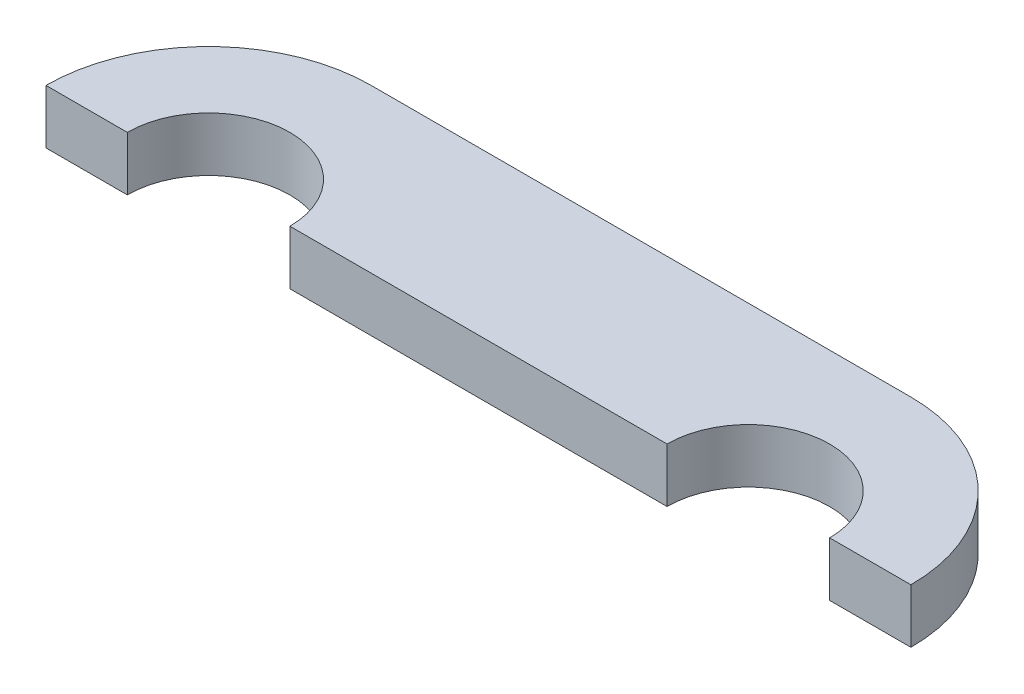
ISO-10303-21;
HEADER;
FILE_DESCRIPTION(('STEP AP214'),'2;1');
FILE_NAME('part.step','',(''),(''),'','','');
FILE_SCHEMA(('AUTOMOTIVE_DESIGN { 1 0 10303 214 1 1 1 1 }'));
ENDSEC;
DATA;
#1=APPLICATION_CONTEXT('core data for automotive mechanical design processes');
#2=APPLICATION_PROTOCOL_DEFINITION('international standard','automotive_design',2000,#1);
#3=PRODUCT_CONTEXT('',#1,'mechanical');
#4=PRODUCT('Part','Part','',(#3));
#5=PRODUCT_RELATED_PRODUCT_CATEGORY('part','',(#4));
#6=PRODUCT_DEFINITION_FORMATION('','',#4);
#7=PRODUCT_DEFINITION_CONTEXT('part definition',#1,'design');
#8=PRODUCT_DEFINITION('design','',#6,#7);
#9=PRODUCT_DEFINITION_SHAPE('','',#8);
#10=(LENGTH_UNIT() NAMED_UNIT(*) SI_UNIT(.MILLI.,.METRE.));
#11=(NAMED_UNIT(*) PLANE_ANGLE_UNIT() SI_UNIT($,.RADIAN.));
#12=(NAMED_UNIT(*) SI_UNIT($,.STERADIAN.) SOLID_ANGLE_UNIT());
#13=UNCERTAINTY_MEASURE_WITH_UNIT(LENGTH_MEASURE(1.E-05),#10,'distance_accuracy_value','');
#14=(GEOMETRIC_REPRESENTATION_CONTEXT(3) GLOBAL_UNCERTAINTY_ASSIGNED_CONTEXT((#13)) GLOBAL_UNIT_ASSIGNED_CONTEXT((#10,
#11,#12)) REPRESENTATION_CONTEXT('',''));
#15=CARTESIAN_POINT('',(0.,0.,0.));
#16=DIRECTION('',(0.,0.,1.));
#17=DIRECTION('',(1.,0.,0.));
#18=AXIS2_PLACEMENT_3D('',#15,#16,#17);
#19=CARTESIAN_POINT('',(-6.35,15.875,0.));
#20=DIRECTION('',(0.,1.,0.));
#21=DIRECTION('',(0.,0.,1.));
#22=AXIS2_PLACEMENT_3D('',#19,#20,#21);
#23=CYLINDRICAL_SURFACE('',#22,4.7625);
#24=DIRECTION('',(0.,1.,0.));
#25=VECTOR('',#24,1.);
#26=CARTESIAN_POINT('',(-11.1125,15.875,0.));
#27=LINE('',#26,#25);
#28=CARTESIAN_POINT('',(-11.1125,15.875,0.));
#29=VERTEX_POINT('',#28);
#30=CARTESIAN_POINT('',(-11.1125,17.4625,0.));
#31=VERTEX_POINT('',#30);
#32=EDGE_CURVE('E96',#29,#31,#27,.T.);
#33=ORIENTED_EDGE('',*,*,#32,.T.);
#34=CARTESIAN_POINT('',(-6.35,17.4625,0.));
#35=DIRECTION('',(0.,-1.,0.));
#36=DIRECTION('',(0.,0.,-1.));
#37=AXIS2_PLACEMENT_3D('',#34,#35,#36);
#38=CIRCLE('',#37,4.7625);
#39=CARTESIAN_POINT('',(-6.35,17.4625,-4.7625));
#40=VERTEX_POINT('',#39);
#41=EDGE_CURVE('E136',#31,#40,#38,.T.);
#42=ORIENTED_EDGE('',*,*,#41,.T.);
#43=DIRECTION('',(0.,1.,0.));
#44=VECTOR('',#43,1.);
#45=CARTESIAN_POINT('',(-6.35,15.875,-4.7625));
#46=LINE('',#45,#44);
#47=CARTESIAN_POINT('',(-6.35,15.875,-4.7625));
#48=VERTEX_POINT('',#47);
#49=EDGE_CURVE('E117',#48,#40,#46,.T.);
#50=ORIENTED_EDGE('',*,*,#49,.F.);
#51=CARTESIAN_POINT('',(-6.35,15.875,0.));
#52=DIRECTION('',(0.,-1.,0.));
#53=DIRECTION('',(0.,0.,-1.));
#54=AXIS2_PLACEMENT_3D('',#51,#52,#53);
#55=CIRCLE('',#54,4.7625);
#56=EDGE_CURVE('E109',#29,#48,#55,.T.);
#57=ORIENTED_EDGE('',*,*,#56,.F.);
#58=EDGE_LOOP('',(#33,#42,#50,#57));
#59=FACE_BOUND('',#58,.T.);
#60=ADVANCED_FACE('F35',(#59),#23,.T.);
#61=CARTESIAN_POINT('',(9.4615,15.875,0.));
#62=DIRECTION('',(0.,1.,0.));
#63=DIRECTION('',(0.,0.,1.));
#64=AXIS2_PLACEMENT_3D('',#61,#62,#63);
#65=CYLINDRICAL_SURFACE('',#64,4.7625);
#66=DIRECTION('',(0.,1.,0.));
#67=VECTOR('',#66,1.);
#68=CARTESIAN_POINT('',(14.224,15.875,0.));
#69=LINE('',#68,#67);
#70=CARTESIAN_POINT('',(14.224,15.875,0.));
#71=VERTEX_POINT('',#70);
#72=CARTESIAN_POINT('',(14.224,17.4625,0.));
#73=VERTEX_POINT('',#72);
#74=EDGE_CURVE('E103',#71,#73,#69,.T.);
#75=ORIENTED_EDGE('',*,*,#74,.F.);
#76=CARTESIAN_POINT('',(9.4615,15.875,0.));
#77=DIRECTION('',(0.,-1.,0.));
#78=DIRECTION('',(0.,0.,-1.));
#79=AXIS2_PLACEMENT_3D('',#76,#77,#78);
#80=CIRCLE('',#79,4.7625);
#81=CARTESIAN_POINT('',(9.4615,15.875,-4.7625));
#82=VERTEX_POINT('',#81);
#83=EDGE_CURVE('E122',#82,#71,#80,.T.);
#84=ORIENTED_EDGE('',*,*,#83,.F.);
#85=DIRECTION('',(0.,1.,0.));
#86=VECTOR('',#85,1.);
#87=CARTESIAN_POINT('',(9.4615,15.875,-4.7625));
#88=LINE('',#87,#86);
#89=CARTESIAN_POINT('',(9.4615,17.4625,-4.7625));
#90=VERTEX_POINT('',#89);
#91=EDGE_CURVE('E135',#82,#90,#88,.T.);
#92=ORIENTED_EDGE('',*,*,#91,.T.);
#93=CARTESIAN_POINT('',(9.4615,17.4625,0.));
#94=DIRECTION('',(0.,-1.,0.));
#95=DIRECTION('',(0.,0.,-1.));
#96=AXIS2_PLACEMENT_3D('',#93,#94,#95);
#97=CIRCLE('',#96,4.7625);
#98=EDGE_CURVE('E140',#90,#73,#97,.T.);
#99=ORIENTED_EDGE('',*,*,#98,.T.);
#100=EDGE_LOOP('',(#75,#84,#92,#99));
#101=FACE_BOUND('',#100,.T.);
#102=ADVANCED_FACE('F169',(#101),#65,.T.);
#103=CARTESIAN_POINT('',(9.4615,15.875,0.));
#104=DIRECTION('',(0.,1.,0.));
#105=DIRECTION('',(0.,0.,1.));
#106=AXIS2_PLACEMENT_3D('',#103,#104,#105);
#107=CYLINDRICAL_SURFACE('',#106,2.38125);
#108=CARTESIAN_POINT('',(9.4615,17.4625,0.));
#109=DIRECTION('',(0.,-1.,0.));
#110=DIRECTION('',(0.,0.,-1.));
#111=AXIS2_PLACEMENT_3D('',#108,#109,#110);
#112=CIRCLE('',#111,2.38125);
#113=CARTESIAN_POINT('',(7.08025,17.4625,0.));
#114=VERTEX_POINT('',#113);
#115=CARTESIAN_POINT('',(11.84275,17.4625,0.));
#116=VERTEX_POINT('',#115);
#117=EDGE_CURVE('E125',#114,#116,#112,.T.);
#118=ORIENTED_EDGE('',*,*,#117,.F.);
#119=DIRECTION('',(0.,1.,0.));
#120=VECTOR('',#119,1.);
#121=CARTESIAN_POINT('',(7.08025,15.875,0.));
#122=LINE('',#121,#120);
#123=CARTESIAN_POINT('',(7.08025,15.875,0.));
#124=VERTEX_POINT('',#123);
#125=EDGE_CURVE('E56',#124,#114,#122,.T.);
#126=ORIENTED_EDGE('',*,*,#125,.F.);
#127=CARTESIAN_POINT('',(9.4615,15.875,0.));
#128=DIRECTION('',(0.,-1.,0.));
#129=DIRECTION('',(0.,0.,-1.));
#130=AXIS2_PLACEMENT_3D('',#127,#128,#129);
#131=CIRCLE('',#130,2.38125);
#132=CARTESIAN_POINT('',(11.84275,15.875,0.));
#133=VERTEX_POINT('',#132);
#134=EDGE_CURVE('E131',#124,#133,#131,.T.);
#135=ORIENTED_EDGE('',*,*,#134,.T.);
#136=DIRECTION('',(0.,1.,0.));
#137=VECTOR('',#136,1.);
#138=CARTESIAN_POINT('',(11.84275,15.875,0.));
#139=LINE('',#138,#137);
#140=EDGE_CURVE('E172',#133,#116,#139,.T.);
#141=ORIENTED_EDGE('',*,*,#140,.T.);
#142=EDGE_LOOP('',(#118,#126,#135,#141));
#143=FACE_BOUND('',#142,.T.);
#144=ADVANCED_FACE('F178',(#143),#107,.F.);
#145=CARTESIAN_POINT('',(-6.35,15.875,0.));
#146=DIRECTION('',(0.,1.,0.));
#147=DIRECTION('',(0.,0.,1.));
#148=AXIS2_PLACEMENT_3D('',#145,#146,#147);
#149=CYLINDRICAL_SURFACE('',#148,2.38125);
#150=CARTESIAN_POINT('',(-6.35,17.4625,0.));
#151=DIRECTION('',(0.,-1.,0.));
#152=DIRECTION('',(0.,0.,-1.));
#153=AXIS2_PLACEMENT_3D('',#150,#151,#152);
#154=CIRCLE('',#153,2.38125);
#155=CARTESIAN_POINT('',(-8.73125,17.4625,0.));
#156=VERTEX_POINT('',#155);
#157=CARTESIAN_POINT('',(-3.96875,17.4625,0.));
#158=VERTEX_POINT('',#157);
#159=EDGE_CURVE('E120',#156,#158,#154,.T.);
#160=ORIENTED_EDGE('',*,*,#159,.F.);
#161=DIRECTION('',(0.,1.,0.));
#162=VECTOR('',#161,1.);
#163=CARTESIAN_POINT('',(-8.73125,15.875,0.));
#164=LINE('',#163,#162);
#165=CARTESIAN_POINT('',(-8.73125,15.875,0.));
#166=VERTEX_POINT('',#165);
#167=EDGE_CURVE('E48',#166,#156,#164,.T.);
#168=ORIENTED_EDGE('',*,*,#167,.F.);
#169=CARTESIAN_POINT('',(-6.35,15.875,0.));
#170=DIRECTION('',(0.,-1.,0.));
#171=DIRECTION('',(0.,0.,-1.));
#172=AXIS2_PLACEMENT_3D('',#169,#170,#171);
#173=CIRCLE('',#172,2.38125);
#174=CARTESIAN_POINT('',(-3.96875,15.875,0.));
#175=VERTEX_POINT('',#174);
#176=EDGE_CURVE('E113',#166,#175,#173,.T.);
#177=ORIENTED_EDGE('',*,*,#176,.T.);
#178=DIRECTION('',(0.,1.,0.));
#179=VECTOR('',#178,1.);
#180=CARTESIAN_POINT('',(-3.96875,15.875,0.));
#181=LINE('',#180,#179);
#182=EDGE_CURVE('E151',#175,#158,#181,.T.);
#183=ORIENTED_EDGE('',*,*,#182,.T.);
#184=EDGE_LOOP('',(#160,#168,#177,#183));
#185=FACE_BOUND('',#184,.T.);
#186=ADVANCED_FACE('F156',(#185),#149,.F.);
#187=CARTESIAN_POINT('',(0.,15.875,0.));
#188=DIRECTION('',(0.,-1.,0.));
#189=DIRECTION('',(0.,0.,-1.));
#190=AXIS2_PLACEMENT_3D('',#187,#188,#189);
#191=PLANE('',#190);
#192=ORIENTED_EDGE('',*,*,#176,.F.);
#193=DIRECTION('',(1.,0.,0.));
#194=VECTOR('',#193,1.);
#195=CARTESIAN_POINT('',(0.,15.875,0.));
#196=LINE('',#195,#194);
#197=EDGE_CURVE('E99',#29,#166,#196,.T.);
#198=ORIENTED_EDGE('',*,*,#197,.F.);
#199=ORIENTED_EDGE('',*,*,#56,.T.);
#200=DIRECTION('',(1.,0.,0.));
#201=VECTOR('',#200,1.);
#202=CARTESIAN_POINT('',(0.,15.875,-4.7625));
#203=LINE('',#202,#201);
#204=EDGE_CURVE('E119',#48,#82,#203,.T.);
#205=ORIENTED_EDGE('',*,*,#204,.T.);
#206=ORIENTED_EDGE('',*,*,#83,.T.);
#207=EDGE_CURVE('E114',#133,#71,#196,.T.);
#208=ORIENTED_EDGE('',*,*,#207,.F.);
#209=ORIENTED_EDGE('',*,*,#134,.F.);
#210=EDGE_CURVE('E104',#175,#124,#196,.T.);
#211=ORIENTED_EDGE('',*,*,#210,.F.);
#212=EDGE_LOOP('',(#192,#198,#199,#205,#206,#208,#209,#211));
#213=FACE_BOUND('',#212,.T.);
#214=ADVANCED_FACE('F108',(#213),#191,.T.);
#215=CARTESIAN_POINT('',(0.,17.4625,0.));
#216=DIRECTION('',(0.,-1.,0.));
#217=DIRECTION('',(0.,0.,-1.));
#218=AXIS2_PLACEMENT_3D('',#215,#216,#217);
#219=PLANE('',#218);
#220=DIRECTION('',(-1.,0.,0.));
#221=VECTOR('',#220,1.);
#222=CARTESIAN_POINT('',(0.,17.4625,0.));
#223=LINE('',#222,#221);
#224=EDGE_CURVE('E11',#156,#31,#223,.T.);
#225=ORIENTED_EDGE('',*,*,#224,.F.);
#226=ORIENTED_EDGE('',*,*,#159,.T.);
#227=DIRECTION('',(-1.,0.,0.));
#228=VECTOR('',#227,1.);
#229=CARTESIAN_POINT('',(0.,17.4625,0.));
#230=LINE('',#229,#228);
#231=EDGE_CURVE('E42',#114,#158,#230,.T.);
#232=ORIENTED_EDGE('',*,*,#231,.F.);
#233=ORIENTED_EDGE('',*,*,#117,.T.);
#234=DIRECTION('',(-1.,0.,0.));
#235=VECTOR('',#234,1.);
#236=CARTESIAN_POINT('',(0.,17.4625,0.));
#237=LINE('',#236,#235);
#238=EDGE_CURVE('E148',#73,#116,#237,.T.);
#239=ORIENTED_EDGE('',*,*,#238,.F.);
#240=ORIENTED_EDGE('',*,*,#98,.F.);
#241=DIRECTION('',(1.,0.,0.));
#242=VECTOR('',#241,1.);
#243=CARTESIAN_POINT('',(0.,17.4625,-4.7625));
#244=LINE('',#243,#242);
#245=EDGE_CURVE('E138',#40,#90,#244,.T.);
#246=ORIENTED_EDGE('',*,*,#245,.F.);
#247=ORIENTED_EDGE('',*,*,#41,.F.);
#248=EDGE_LOOP('',(#225,#226,#232,#233,#239,#240,#246,#247));
#249=FACE_BOUND('',#248,.T.);
#250=ADVANCED_FACE('F158',(#249),#219,.F.);
#251=CARTESIAN_POINT('',(0.,15.875,-4.7625));
#252=DIRECTION('',(0.,0.,1.));
#253=DIRECTION('',(1.,0.,0.));
#254=AXIS2_PLACEMENT_3D('',#251,#252,#253);
#255=PLANE('',#254);
#256=ORIENTED_EDGE('',*,*,#245,.T.);
#257=ORIENTED_EDGE('',*,*,#91,.F.);
#258=ORIENTED_EDGE('',*,*,#204,.F.);
#259=ORIENTED_EDGE('',*,*,#49,.T.);
#260=EDGE_LOOP('',(#256,#257,#258,#259));
#261=FACE_BOUND('',#260,.T.);
#262=ADVANCED_FACE('F162',(#261),#255,.F.);
#263=CARTESIAN_POINT('',(0.,15.875,0.));
#264=DIRECTION('',(0.,0.,1.));
#265=DIRECTION('',(1.,0.,0.));
#266=AXIS2_PLACEMENT_3D('',#263,#264,#265);
#267=PLANE('',#266);
#268=ORIENTED_EDGE('',*,*,#238,.T.);
#269=ORIENTED_EDGE('',*,*,#140,.F.);
#270=ORIENTED_EDGE('',*,*,#207,.T.);
#271=ORIENTED_EDGE('',*,*,#74,.T.);
#272=EDGE_LOOP('',(#268,#269,#270,#271));
#273=FACE_BOUND('',#272,.T.);
#274=ADVANCED_FACE('F179',(#273),#267,.T.);
#275=ORIENTED_EDGE('',*,*,#231,.T.);
#276=ORIENTED_EDGE('',*,*,#182,.F.);
#277=ORIENTED_EDGE('',*,*,#210,.T.);
#278=ORIENTED_EDGE('',*,*,#125,.T.);
#279=EDGE_LOOP('',(#275,#276,#277,#278));
#280=FACE_BOUND('',#279,.T.);
#281=ADVANCED_FACE('F150',(#280),#267,.T.);
#282=ORIENTED_EDGE('',*,*,#224,.T.);
#283=ORIENTED_EDGE('',*,*,#32,.F.);
#284=ORIENTED_EDGE('',*,*,#197,.T.);
#285=ORIENTED_EDGE('',*,*,#167,.T.);
#286=EDGE_LOOP('',(#282,#283,#284,#285));
#287=FACE_BOUND('',#286,.T.);
#288=ADVANCED_FACE('F98',(#287),#267,.T.);
#289=CLOSED_SHELL('',(#60,#102,#144,#186,#214,#250,#262,#274,#281,#288));
#290=MANIFOLD_SOLID_BREP('B2',#289);
#291=ADVANCED_BREP_SHAPE_REPRESENTATION('',(#18,#290),#14);
#292=SHAPE_DEFINITION_REPRESENTATION(#9,#291);
ENDSEC;
END-ISO-10303-21;
